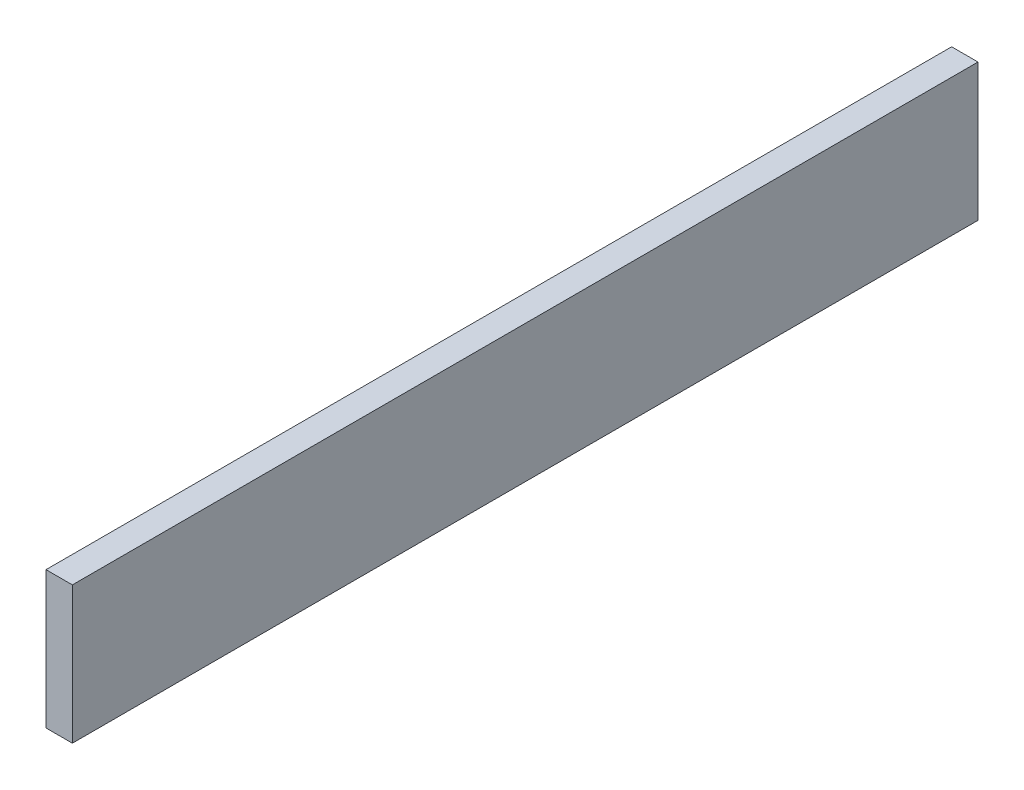
ISO-10303-21;
HEADER;
FILE_DESCRIPTION(('STEP AP214'),'2;1');
FILE_NAME('part.step','',(''),(''),'','','');
FILE_SCHEMA(('AUTOMOTIVE_DESIGN { 1 0 10303 214 1 1 1 1 }'));
ENDSEC;
DATA;
#1=APPLICATION_CONTEXT('core data for automotive mechanical design processes');
#2=APPLICATION_PROTOCOL_DEFINITION('international standard','automotive_design',2000,#1);
#3=PRODUCT_CONTEXT('',#1,'mechanical');
#4=PRODUCT('Part','Part','',(#3));
#5=PRODUCT_RELATED_PRODUCT_CATEGORY('part','',(#4));
#6=PRODUCT_DEFINITION_FORMATION('','',#4);
#7=PRODUCT_DEFINITION_CONTEXT('part definition',#1,'design');
#8=PRODUCT_DEFINITION('design','',#6,#7);
#9=PRODUCT_DEFINITION_SHAPE('','',#8);
#10=(LENGTH_UNIT() NAMED_UNIT(*) SI_UNIT(.MILLI.,.METRE.));
#11=(NAMED_UNIT(*) PLANE_ANGLE_UNIT() SI_UNIT($,.RADIAN.));
#12=(NAMED_UNIT(*) SI_UNIT($,.STERADIAN.) SOLID_ANGLE_UNIT());
#13=UNCERTAINTY_MEASURE_WITH_UNIT(LENGTH_MEASURE(1.E-05),#10,'distance_accuracy_value','');
#14=(GEOMETRIC_REPRESENTATION_CONTEXT(3) GLOBAL_UNCERTAINTY_ASSIGNED_CONTEXT((#13)) GLOBAL_UNIT_ASSIGNED_CONTEXT((#10,
#11,#12)) REPRESENTATION_CONTEXT('',''));
#15=CARTESIAN_POINT('',(0.,0.,0.));
#16=DIRECTION('',(0.,0.,1.));
#17=DIRECTION('',(1.,0.,0.));
#18=AXIS2_PLACEMENT_3D('',#15,#16,#17);
#19=CARTESIAN_POINT('',(55.,0.,2990.596));
#20=DIRECTION('',(0.,0.,1.));
#21=DIRECTION('',(1.,0.,0.));
#22=AXIS2_PLACEMENT_3D('',#19,#20,#21);
#23=PLANE('',#22);
#24=DIRECTION('',(0.,1.,0.));
#25=VECTOR('',#24,1.);
#26=CARTESIAN_POINT('',(50.,0.,2990.596));
#27=LINE('',#26,#25);
#28=CARTESIAN_POINT('',(50.,-800.1,2990.596));
#29=VERTEX_POINT('',#28);
#30=CARTESIAN_POINT('',(50.,-774.1,2990.596));
#31=VERTEX_POINT('',#30);
#32=EDGE_CURVE('E104',#29,#31,#27,.T.);
#33=ORIENTED_EDGE('',*,*,#32,.T.);
#34=DIRECTION('',(-1.,0.,0.));
#35=VECTOR('',#34,1.);
#36=CARTESIAN_POINT('',(55.,-774.1,2990.596));
#37=LINE('',#36,#35);
#38=CARTESIAN_POINT('',(55.,-774.1,2990.596));
#39=VERTEX_POINT('',#38);
#40=EDGE_CURVE('E11',#39,#31,#37,.T.);
#41=ORIENTED_EDGE('',*,*,#40,.F.);
#42=DIRECTION('',(0.,1.,0.));
#43=VECTOR('',#42,1.);
#44=CARTESIAN_POINT('',(55.,0.,2990.596));
#45=LINE('',#44,#43);
#46=CARTESIAN_POINT('',(55.,-800.1,2990.596));
#47=VERTEX_POINT('',#46);
#48=EDGE_CURVE('E83',#47,#39,#45,.T.);
#49=ORIENTED_EDGE('',*,*,#48,.F.);
#50=DIRECTION('',(-1.,0.,0.));
#51=VECTOR('',#50,1.);
#52=CARTESIAN_POINT('',(55.,-800.1,2990.596));
#53=LINE('',#52,#51);
#54=EDGE_CURVE('E103',#47,#29,#53,.T.);
#55=ORIENTED_EDGE('',*,*,#54,.T.);
#56=EDGE_LOOP('',(#33,#41,#49,#55));
#57=FACE_BOUND('',#56,.T.);
#58=ADVANCED_FACE('F41',(#57),#23,.F.);
#59=CARTESIAN_POINT('',(55.,-774.1,0.));
#60=DIRECTION('',(0.,1.,0.));
#61=DIRECTION('',(0.,0.,1.));
#62=AXIS2_PLACEMENT_3D('',#59,#60,#61);
#63=PLANE('',#62);
#64=DIRECTION('',(0.,0.,-1.));
#65=VECTOR('',#64,1.);
#66=CARTESIAN_POINT('',(50.,-774.1,0.));
#67=LINE('',#66,#65);
#68=CARTESIAN_POINT('',(50.,-774.1,3162.3));
#69=VERTEX_POINT('',#68);
#70=EDGE_CURVE('E93',#69,#31,#67,.T.);
#71=ORIENTED_EDGE('',*,*,#70,.F.);
#72=DIRECTION('',(-1.,0.,0.));
#73=VECTOR('',#72,1.);
#74=CARTESIAN_POINT('',(55.,-774.1,3162.3));
#75=LINE('',#74,#73);
#76=CARTESIAN_POINT('',(55.,-774.1,3162.3));
#77=VERTEX_POINT('',#76);
#78=EDGE_CURVE('E49',#77,#69,#75,.T.);
#79=ORIENTED_EDGE('',*,*,#78,.F.);
#80=DIRECTION('',(0.,0.,-1.));
#81=VECTOR('',#80,1.);
#82=CARTESIAN_POINT('',(55.,-774.1,0.));
#83=LINE('',#82,#81);
#84=EDGE_CURVE('E91',#77,#39,#83,.T.);
#85=ORIENTED_EDGE('',*,*,#84,.T.);
#86=ORIENTED_EDGE('',*,*,#40,.T.);
#87=EDGE_LOOP('',(#71,#79,#85,#86));
#88=FACE_BOUND('',#87,.T.);
#89=ADVANCED_FACE('F90',(#88),#63,.T.);
#90=CARTESIAN_POINT('',(55.,0.,3162.3));
#91=DIRECTION('',(0.,0.,-1.));
#92=DIRECTION('',(-1.,0.,0.));
#93=AXIS2_PLACEMENT_3D('',#90,#91,#92);
#94=PLANE('',#93);
#95=DIRECTION('',(0.,-1.,0.));
#96=VECTOR('',#95,1.);
#97=CARTESIAN_POINT('',(50.,0.,3162.3));
#98=LINE('',#97,#96);
#99=CARTESIAN_POINT('',(50.,-800.1,3162.3));
#100=VERTEX_POINT('',#99);
#101=EDGE_CURVE('E72',#69,#100,#98,.T.);
#102=ORIENTED_EDGE('',*,*,#101,.T.);
#103=DIRECTION('',(-1.,0.,0.));
#104=VECTOR('',#103,1.);
#105=CARTESIAN_POINT('',(55.,-800.1,3162.3));
#106=LINE('',#105,#104);
#107=CARTESIAN_POINT('',(55.,-800.1,3162.3));
#108=VERTEX_POINT('',#107);
#109=EDGE_CURVE('E94',#108,#100,#106,.T.);
#110=ORIENTED_EDGE('',*,*,#109,.F.);
#111=DIRECTION('',(0.,-1.,0.));
#112=VECTOR('',#111,1.);
#113=CARTESIAN_POINT('',(55.,0.,3162.3));
#114=LINE('',#113,#112);
#115=EDGE_CURVE('E95',#77,#108,#114,.T.);
#116=ORIENTED_EDGE('',*,*,#115,.F.);
#117=ORIENTED_EDGE('',*,*,#78,.T.);
#118=EDGE_LOOP('',(#102,#110,#116,#117));
#119=FACE_BOUND('',#118,.T.);
#120=ADVANCED_FACE('F96',(#119),#94,.F.);
#121=CARTESIAN_POINT('',(55.,-800.1,0.));
#122=DIRECTION('',(0.,1.,0.));
#123=DIRECTION('',(0.,0.,1.));
#124=AXIS2_PLACEMENT_3D('',#121,#122,#123);
#125=PLANE('',#124);
#126=DIRECTION('',(0.,0.,-1.));
#127=VECTOR('',#126,1.);
#128=CARTESIAN_POINT('',(50.,-800.1,0.));
#129=LINE('',#128,#127);
#130=EDGE_CURVE('E78',#100,#29,#129,.T.);
#131=ORIENTED_EDGE('',*,*,#130,.T.);
#132=ORIENTED_EDGE('',*,*,#54,.F.);
#133=DIRECTION('',(0.,0.,-1.));
#134=VECTOR('',#133,1.);
#135=CARTESIAN_POINT('',(55.,-800.1,0.));
#136=LINE('',#135,#134);
#137=EDGE_CURVE('E57',#108,#47,#136,.T.);
#138=ORIENTED_EDGE('',*,*,#137,.F.);
#139=ORIENTED_EDGE('',*,*,#109,.T.);
#140=EDGE_LOOP('',(#131,#132,#138,#139));
#141=FACE_BOUND('',#140,.T.);
#142=ADVANCED_FACE('F111',(#141),#125,.F.);
#143=CARTESIAN_POINT('',(55.,0.,0.));
#144=DIRECTION('',(1.,0.,0.));
#145=DIRECTION('',(0.,0.,-1.));
#146=AXIS2_PLACEMENT_3D('',#143,#144,#145);
#147=PLANE('',#146);
#148=ORIENTED_EDGE('',*,*,#48,.T.);
#149=ORIENTED_EDGE('',*,*,#84,.F.);
#150=ORIENTED_EDGE('',*,*,#115,.T.);
#151=ORIENTED_EDGE('',*,*,#137,.T.);
#152=EDGE_LOOP('',(#148,#149,#150,#151));
#153=FACE_BOUND('',#152,.T.);
#154=ADVANCED_FACE('F98',(#153),#147,.T.);
#155=CARTESIAN_POINT('',(50.,0.,0.));
#156=DIRECTION('',(1.,0.,0.));
#157=DIRECTION('',(0.,0.,-1.));
#158=AXIS2_PLACEMENT_3D('',#155,#156,#157);
#159=PLANE('',#158);
#160=ORIENTED_EDGE('',*,*,#32,.F.);
#161=ORIENTED_EDGE('',*,*,#130,.F.);
#162=ORIENTED_EDGE('',*,*,#101,.F.);
#163=ORIENTED_EDGE('',*,*,#70,.T.);
#164=EDGE_LOOP('',(#160,#161,#162,#163));
#165=FACE_BOUND('',#164,.T.);
#166=ADVANCED_FACE('F114',(#165),#159,.F.);
#167=CLOSED_SHELL('',(#58,#89,#120,#142,#154,#166));
#168=MANIFOLD_SOLID_BREP('B2',#167);
#169=ADVANCED_BREP_SHAPE_REPRESENTATION('',(#18,#168),#14);
#170=SHAPE_DEFINITION_REPRESENTATION(#9,#169);
ENDSEC;
END-ISO-10303-21;
